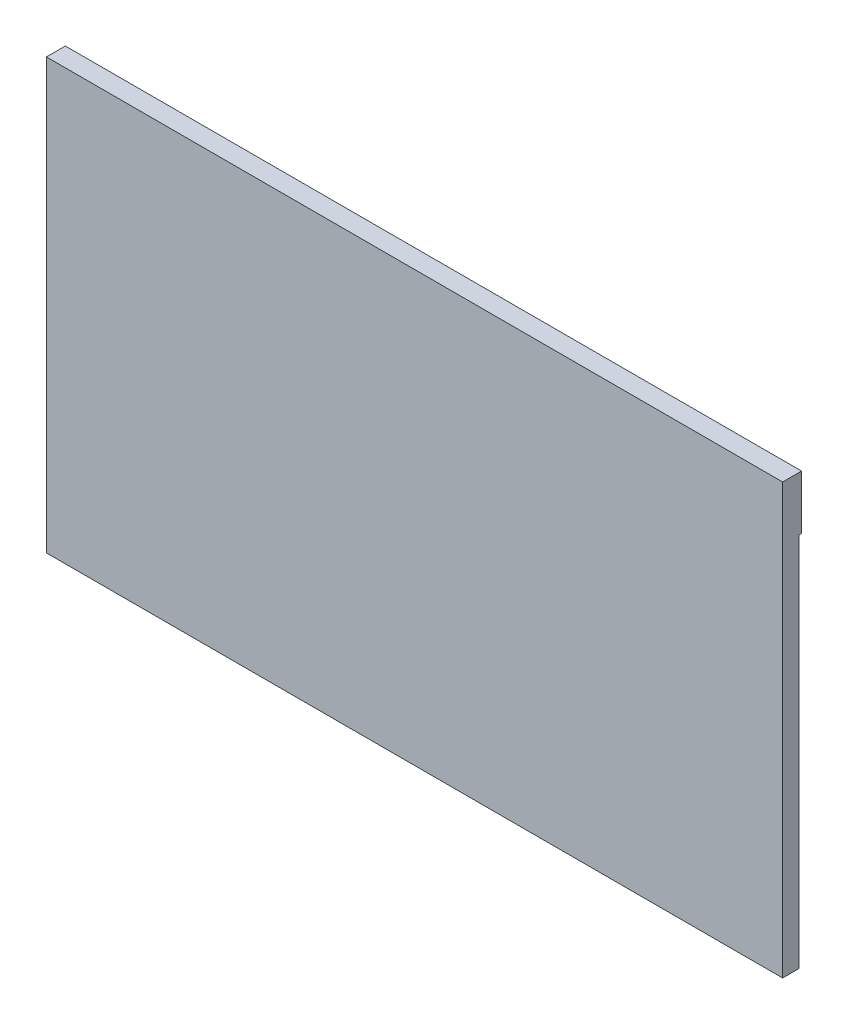
ISO-10303-21;
HEADER;
FILE_DESCRIPTION(('STEP AP214'),'2;1');
FILE_NAME('part.step','',(''),(''),'','','');
FILE_SCHEMA(('AUTOMOTIVE_DESIGN { 1 0 10303 214 1 1 1 1 }'));
ENDSEC;
DATA;
#1=APPLICATION_CONTEXT('core data for automotive mechanical design processes');
#2=APPLICATION_PROTOCOL_DEFINITION('international standard','automotive_design',2000,#1);
#3=PRODUCT_CONTEXT('',#1,'mechanical');
#4=PRODUCT('Part','Part','',(#3));
#5=PRODUCT_RELATED_PRODUCT_CATEGORY('part','',(#4));
#6=PRODUCT_DEFINITION_FORMATION('','',#4);
#7=PRODUCT_DEFINITION_CONTEXT('part definition',#1,'design');
#8=PRODUCT_DEFINITION('design','',#6,#7);
#9=PRODUCT_DEFINITION_SHAPE('','',#8);
#10=(LENGTH_UNIT() NAMED_UNIT(*) SI_UNIT(.MILLI.,.METRE.));
#11=(NAMED_UNIT(*) PLANE_ANGLE_UNIT() SI_UNIT($,.RADIAN.));
#12=(NAMED_UNIT(*) SI_UNIT($,.STERADIAN.) SOLID_ANGLE_UNIT());
#13=UNCERTAINTY_MEASURE_WITH_UNIT(LENGTH_MEASURE(1.E-05),#10,'distance_accuracy_value','');
#14=(GEOMETRIC_REPRESENTATION_CONTEXT(3) GLOBAL_UNCERTAINTY_ASSIGNED_CONTEXT((#13)) GLOBAL_UNIT_ASSIGNED_CONTEXT((#10,
#11,#12)) REPRESENTATION_CONTEXT('',''));
#15=CARTESIAN_POINT('',(0.,0.,0.));
#16=DIRECTION('',(0.,0.,1.));
#17=DIRECTION('',(1.,0.,0.));
#18=AXIS2_PLACEMENT_3D('',#15,#16,#17);
#19=CARTESIAN_POINT('',(0.,0.,0.));
#20=DIRECTION('',(0.,0.,1.));
#21=DIRECTION('',(1.,0.,0.));
#22=AXIS2_PLACEMENT_3D('',#19,#20,#21);
#23=PLANE('',#22);
#24=DIRECTION('',(0.,-1.,0.));
#25=VECTOR('',#24,1.);
#26=CARTESIAN_POINT('',(197.5,139.,0.));
#27=LINE('',#26,#25);
#28=CARTESIAN_POINT('',(197.5,119.,0.));
#29=VERTEX_POINT('',#28);
#30=CARTESIAN_POINT('',(197.5,109.,0.));
#31=VERTEX_POINT('',#30);
#32=EDGE_CURVE('E156',#29,#31,#27,.T.);
#33=ORIENTED_EDGE('',*,*,#32,.F.);
#34=DIRECTION('',(-1.,0.,0.));
#35=VECTOR('',#34,1.);
#36=CARTESIAN_POINT('',(272.5,119.,0.));
#37=LINE('',#36,#35);
#38=CARTESIAN_POINT('',(272.5,119.,0.));
#39=VERTEX_POINT('',#38);
#40=EDGE_CURVE('E63',#39,#29,#37,.T.);
#41=ORIENTED_EDGE('',*,*,#40,.F.);
#42=DIRECTION('',(0.,1.,0.));
#43=VECTOR('',#42,1.);
#44=CARTESIAN_POINT('',(272.5,159.,0.));
#45=LINE('',#44,#43);
#46=CARTESIAN_POINT('',(272.5,-159.,0.));
#47=VERTEX_POINT('',#46);
#48=EDGE_CURVE('E197',#47,#39,#45,.T.);
#49=ORIENTED_EDGE('',*,*,#48,.F.);
#50=DIRECTION('',(1.,0.,0.));
#51=VECTOR('',#50,1.);
#52=CARTESIAN_POINT('',(-272.5,-159.,0.));
#53=LINE('',#52,#51);
#54=CARTESIAN_POINT('',(-272.5,-159.,0.));
#55=VERTEX_POINT('',#54);
#56=EDGE_CURVE('E203',#55,#47,#53,.T.);
#57=ORIENTED_EDGE('',*,*,#56,.F.);
#58=DIRECTION('',(0.,-1.,0.));
#59=VECTOR('',#58,1.);
#60=CARTESIAN_POINT('',(-272.5,159.,0.));
#61=LINE('',#60,#59);
#62=CARTESIAN_POINT('',(-272.5,119.,0.));
#63=VERTEX_POINT('',#62);
#64=EDGE_CURVE('E215',#63,#55,#61,.T.);
#65=ORIENTED_EDGE('',*,*,#64,.F.);
#66=CARTESIAN_POINT('',(147.5,119.,0.));
#67=VERTEX_POINT('',#66);
#68=EDGE_CURVE('E169',#67,#63,#37,.T.);
#69=ORIENTED_EDGE('',*,*,#68,.F.);
#70=DIRECTION('',(0.,1.,0.));
#71=VECTOR('',#70,1.);
#72=CARTESIAN_POINT('',(147.5,139.,0.));
#73=LINE('',#72,#71);
#74=CARTESIAN_POINT('',(147.5,109.,0.));
#75=VERTEX_POINT('',#74);
#76=EDGE_CURVE('E153',#75,#67,#73,.T.);
#77=ORIENTED_EDGE('',*,*,#76,.F.);
#78=DIRECTION('',(-1.,0.,0.));
#79=VECTOR('',#78,1.);
#80=CARTESIAN_POINT('',(197.5,109.,0.));
#81=LINE('',#80,#79);
#82=EDGE_CURVE('E269',#31,#75,#81,.T.);
#83=ORIENTED_EDGE('',*,*,#82,.F.);
#84=EDGE_LOOP('',(#33,#41,#49,#57,#65,#69,#77,#83));
#85=FACE_BOUND('',#84,.T.);
#86=ADVANCED_FACE('F39',(#85),#23,.F.);
#87=CARTESIAN_POINT('',(272.5,119.,-2.));
#88=DIRECTION('',(0.,1.,0.));
#89=DIRECTION('',(0.,0.,1.));
#90=AXIS2_PLACEMENT_3D('',#87,#88,#89);
#91=PLANE('',#90);
#92=DIRECTION('',(0.,0.,1.));
#93=VECTOR('',#92,1.);
#94=CARTESIAN_POINT('',(197.5,119.,-2.));
#95=LINE('',#94,#93);
#96=CARTESIAN_POINT('',(197.5,119.,-2.));
#97=VERTEX_POINT('',#96);
#98=EDGE_CURVE('E162',#97,#29,#95,.T.);
#99=ORIENTED_EDGE('',*,*,#98,.F.);
#100=DIRECTION('',(-1.,0.,0.));
#101=VECTOR('',#100,1.);
#102=CARTESIAN_POINT('',(272.5,119.,-2.));
#103=LINE('',#102,#101);
#104=CARTESIAN_POINT('',(272.5,119.,-2.));
#105=VERTEX_POINT('',#104);
#106=EDGE_CURVE('E175',#105,#97,#103,.T.);
#107=ORIENTED_EDGE('',*,*,#106,.F.);
#108=DIRECTION('',(0.,0.,1.));
#109=VECTOR('',#108,1.);
#110=CARTESIAN_POINT('',(272.5,119.,-2.));
#111=LINE('',#110,#109);
#112=EDGE_CURVE('E193',#105,#39,#111,.T.);
#113=ORIENTED_EDGE('',*,*,#112,.T.);
#114=ORIENTED_EDGE('',*,*,#40,.T.);
#115=EDGE_LOOP('',(#99,#107,#113,#114));
#116=FACE_BOUND('',#115,.T.);
#117=ADVANCED_FACE('F268',(#116),#91,.F.);
#118=DIRECTION('',(0.,0.,-1.));
#119=VECTOR('',#118,1.);
#120=CARTESIAN_POINT('',(147.5,119.,-2.));
#121=LINE('',#120,#119);
#122=CARTESIAN_POINT('',(147.5,119.,-2.));
#123=VERTEX_POINT('',#122);
#124=EDGE_CURVE('E158',#67,#123,#121,.T.);
#125=ORIENTED_EDGE('',*,*,#124,.F.);
#126=ORIENTED_EDGE('',*,*,#68,.T.);
#127=DIRECTION('',(0.,0.,1.));
#128=VECTOR('',#127,1.);
#129=CARTESIAN_POINT('',(-272.5,119.,-2.));
#130=LINE('',#129,#128);
#131=CARTESIAN_POINT('',(-272.5,119.,-2.));
#132=VERTEX_POINT('',#131);
#133=EDGE_CURVE('E187',#132,#63,#130,.T.);
#134=ORIENTED_EDGE('',*,*,#133,.F.);
#135=EDGE_CURVE('E174',#123,#132,#103,.T.);
#136=ORIENTED_EDGE('',*,*,#135,.F.);
#137=EDGE_LOOP('',(#125,#126,#134,#136));
#138=FACE_BOUND('',#137,.T.);
#139=ADVANCED_FACE('F245',(#138),#91,.F.);
#140=CARTESIAN_POINT('',(0.,0.,-2.));
#141=DIRECTION('',(0.,0.,-1.));
#142=DIRECTION('',(-1.,0.,0.));
#143=AXIS2_PLACEMENT_3D('',#140,#141,#142);
#144=PLANE('',#143);
#145=ORIENTED_EDGE('',*,*,#106,.T.);
#146=DIRECTION('',(0.,1.,0.));
#147=VECTOR('',#146,1.);
#148=CARTESIAN_POINT('',(197.5,0.,-2.));
#149=LINE('',#148,#147);
#150=CARTESIAN_POINT('',(197.5,139.,-2.));
#151=VERTEX_POINT('',#150);
#152=EDGE_CURVE('E11',#97,#151,#149,.T.);
#153=ORIENTED_EDGE('',*,*,#152,.T.);
#154=DIRECTION('',(-1.,0.,0.));
#155=VECTOR('',#154,1.);
#156=CARTESIAN_POINT('',(0.,139.,-2.));
#157=LINE('',#156,#155);
#158=CARTESIAN_POINT('',(147.5,139.,-2.));
#159=VERTEX_POINT('',#158);
#160=EDGE_CURVE('E233',#151,#159,#157,.T.);
#161=ORIENTED_EDGE('',*,*,#160,.T.);
#162=DIRECTION('',(0.,-1.,0.));
#163=VECTOR('',#162,1.);
#164=CARTESIAN_POINT('',(147.5,0.,-2.));
#165=LINE('',#164,#163);
#166=EDGE_CURVE('E48',#159,#123,#165,.T.);
#167=ORIENTED_EDGE('',*,*,#166,.T.);
#168=ORIENTED_EDGE('',*,*,#135,.T.);
#169=DIRECTION('',(0.,1.,0.));
#170=VECTOR('',#169,1.);
#171=CARTESIAN_POINT('',(-272.5,159.,-2.));
#172=LINE('',#171,#170);
#173=CARTESIAN_POINT('',(-272.5,159.,-2.));
#174=VERTEX_POINT('',#173);
#175=EDGE_CURVE('E179',#132,#174,#172,.T.);
#176=ORIENTED_EDGE('',*,*,#175,.T.);
#177=DIRECTION('',(1.,0.,0.));
#178=VECTOR('',#177,1.);
#179=CARTESIAN_POINT('',(272.5,159.,-2.));
#180=LINE('',#179,#178);
#181=CARTESIAN_POINT('',(272.5,159.,-2.));
#182=VERTEX_POINT('',#181);
#183=EDGE_CURVE('E183',#174,#182,#180,.T.);
#184=ORIENTED_EDGE('',*,*,#183,.T.);
#185=DIRECTION('',(0.,-1.,0.));
#186=VECTOR('',#185,1.);
#187=CARTESIAN_POINT('',(272.5,159.,-2.));
#188=LINE('',#187,#186);
#189=EDGE_CURVE('E170',#182,#105,#188,.T.);
#190=ORIENTED_EDGE('',*,*,#189,.T.);
#191=EDGE_LOOP('',(#145,#153,#161,#167,#168,#176,#184,#190));
#192=FACE_BOUND('',#191,.T.);
#193=ADVANCED_FACE('F240',(#192),#144,.T.);
#194=CARTESIAN_POINT('',(272.5,159.,12.));
#195=DIRECTION('',(-1.,0.,0.));
#196=DIRECTION('',(0.,-1.,0.));
#197=AXIS2_PLACEMENT_3D('',#194,#195,#196);
#198=PLANE('',#197);
#199=ORIENTED_EDGE('',*,*,#48,.T.);
#200=ORIENTED_EDGE('',*,*,#112,.F.);
#201=ORIENTED_EDGE('',*,*,#189,.F.);
#202=DIRECTION('',(0.,0.,-1.));
#203=VECTOR('',#202,1.);
#204=CARTESIAN_POINT('',(272.5,159.,12.));
#205=LINE('',#204,#203);
#206=CARTESIAN_POINT('',(272.5,159.,12.));
#207=VERTEX_POINT('',#206);
#208=EDGE_CURVE('E230',#207,#182,#205,.T.);
#209=ORIENTED_EDGE('',*,*,#208,.F.);
#210=DIRECTION('',(0.,1.,0.));
#211=VECTOR('',#210,1.);
#212=CARTESIAN_POINT('',(272.5,159.,12.));
#213=LINE('',#212,#211);
#214=CARTESIAN_POINT('',(272.5,-159.,12.));
#215=VERTEX_POINT('',#214);
#216=EDGE_CURVE('E198',#215,#207,#213,.T.);
#217=ORIENTED_EDGE('',*,*,#216,.F.);
#218=DIRECTION('',(0.,0.,-1.));
#219=VECTOR('',#218,1.);
#220=CARTESIAN_POINT('',(272.5,-159.,12.));
#221=LINE('',#220,#219);
#222=EDGE_CURVE('E212',#215,#47,#221,.T.);
#223=ORIENTED_EDGE('',*,*,#222,.T.);
#224=EDGE_LOOP('',(#199,#200,#201,#209,#217,#223));
#225=FACE_BOUND('',#224,.T.);
#226=ADVANCED_FACE('F41',(#225),#198,.F.);
#227=CARTESIAN_POINT('',(-272.5,159.,12.));
#228=DIRECTION('',(0.,-1.,0.));
#229=DIRECTION('',(0.,0.,-1.));
#230=AXIS2_PLACEMENT_3D('',#227,#228,#229);
#231=PLANE('',#230);
#232=ORIENTED_EDGE('',*,*,#208,.T.);
#233=ORIENTED_EDGE('',*,*,#183,.F.);
#234=DIRECTION('',(0.,0.,-1.));
#235=VECTOR('',#234,1.);
#236=CARTESIAN_POINT('',(-272.5,159.,12.));
#237=LINE('',#236,#235);
#238=CARTESIAN_POINT('',(-272.5,159.,12.));
#239=VERTEX_POINT('',#238);
#240=EDGE_CURVE('E227',#239,#174,#237,.T.);
#241=ORIENTED_EDGE('',*,*,#240,.F.);
#242=DIRECTION('',(-1.,0.,0.));
#243=VECTOR('',#242,1.);
#244=CARTESIAN_POINT('',(-272.5,159.,12.));
#245=LINE('',#244,#243);
#246=EDGE_CURVE('E202',#207,#239,#245,.T.);
#247=ORIENTED_EDGE('',*,*,#246,.F.);
#248=EDGE_LOOP('',(#232,#233,#241,#247));
#249=FACE_BOUND('',#248,.T.);
#250=ADVANCED_FACE('F261',(#249),#231,.F.);
#251=CARTESIAN_POINT('',(-272.5,159.,12.));
#252=DIRECTION('',(1.,0.,0.));
#253=DIRECTION('',(0.,1.,0.));
#254=AXIS2_PLACEMENT_3D('',#251,#252,#253);
#255=PLANE('',#254);
#256=ORIENTED_EDGE('',*,*,#240,.T.);
#257=ORIENTED_EDGE('',*,*,#175,.F.);
#258=ORIENTED_EDGE('',*,*,#133,.T.);
#259=ORIENTED_EDGE('',*,*,#64,.T.);
#260=DIRECTION('',(0.,0.,-1.));
#261=VECTOR('',#260,1.);
#262=CARTESIAN_POINT('',(-272.5,-159.,12.));
#263=LINE('',#262,#261);
#264=CARTESIAN_POINT('',(-272.5,-159.,12.));
#265=VERTEX_POINT('',#264);
#266=EDGE_CURVE('E223',#265,#55,#263,.T.);
#267=ORIENTED_EDGE('',*,*,#266,.F.);
#268=DIRECTION('',(0.,-1.,0.));
#269=VECTOR('',#268,1.);
#270=CARTESIAN_POINT('',(-272.5,159.,12.));
#271=LINE('',#270,#269);
#272=EDGE_CURVE('E206',#239,#265,#271,.T.);
#273=ORIENTED_EDGE('',*,*,#272,.F.);
#274=EDGE_LOOP('',(#256,#257,#258,#259,#267,#273));
#275=FACE_BOUND('',#274,.T.);
#276=ADVANCED_FACE('F255',(#275),#255,.F.);
#277=CARTESIAN_POINT('',(-272.5,-159.,12.));
#278=DIRECTION('',(0.,1.,0.));
#279=DIRECTION('',(0.,0.,1.));
#280=AXIS2_PLACEMENT_3D('',#277,#278,#279);
#281=PLANE('',#280);
#282=ORIENTED_EDGE('',*,*,#56,.T.);
#283=ORIENTED_EDGE('',*,*,#222,.F.);
#284=DIRECTION('',(1.,0.,0.));
#285=VECTOR('',#284,1.);
#286=CARTESIAN_POINT('',(-272.5,-159.,12.));
#287=LINE('',#286,#285);
#288=EDGE_CURVE('E209',#265,#215,#287,.T.);
#289=ORIENTED_EDGE('',*,*,#288,.F.);
#290=ORIENTED_EDGE('',*,*,#266,.T.);
#291=EDGE_LOOP('',(#282,#283,#289,#290));
#292=FACE_BOUND('',#291,.T.);
#293=ADVANCED_FACE('F304',(#292),#281,.F.);
#294=CARTESIAN_POINT('',(0.,0.,12.));
#295=DIRECTION('',(0.,0.,1.));
#296=DIRECTION('',(1.,0.,0.));
#297=AXIS2_PLACEMENT_3D('',#294,#295,#296);
#298=PLANE('',#297);
#299=ORIENTED_EDGE('',*,*,#216,.T.);
#300=ORIENTED_EDGE('',*,*,#246,.T.);
#301=ORIENTED_EDGE('',*,*,#272,.T.);
#302=ORIENTED_EDGE('',*,*,#288,.T.);
#303=EDGE_LOOP('',(#299,#300,#301,#302));
#304=FACE_BOUND('',#303,.T.);
#305=ADVANCED_FACE('F303',(#304),#298,.T.);
#306=CARTESIAN_POINT('',(197.5,139.,-4.));
#307=DIRECTION('',(-1.,0.,0.));
#308=DIRECTION('',(0.,0.,1.));
#309=AXIS2_PLACEMENT_3D('',#306,#307,#308);
#310=PLANE('',#309);
#311=ORIENTED_EDGE('',*,*,#152,.F.);
#312=ORIENTED_EDGE('',*,*,#98,.T.);
#313=ORIENTED_EDGE('',*,*,#32,.T.);
#314=DIRECTION('',(0.,0.,1.));
#315=VECTOR('',#314,1.);
#316=CARTESIAN_POINT('',(197.5,109.,-4.));
#317=LINE('',#316,#315);
#318=CARTESIAN_POINT('',(197.5,109.,-4.));
#319=VERTEX_POINT('',#318);
#320=EDGE_CURVE('E136',#319,#31,#317,.T.);
#321=ORIENTED_EDGE('',*,*,#320,.F.);
#322=DIRECTION('',(0.,-1.,0.));
#323=VECTOR('',#322,1.);
#324=CARTESIAN_POINT('',(197.5,139.,-4.));
#325=LINE('',#324,#323);
#326=CARTESIAN_POINT('',(197.5,139.,-4.));
#327=VERTEX_POINT('',#326);
#328=EDGE_CURVE('E144',#327,#319,#325,.T.);
#329=ORIENTED_EDGE('',*,*,#328,.F.);
#330=DIRECTION('',(0.,0.,1.));
#331=VECTOR('',#330,1.);
#332=CARTESIAN_POINT('',(197.5,139.,-4.));
#333=LINE('',#332,#331);
#334=EDGE_CURVE('E279',#327,#151,#333,.T.);
#335=ORIENTED_EDGE('',*,*,#334,.T.);
#336=EDGE_LOOP('',(#311,#312,#313,#321,#329,#335));
#337=FACE_BOUND('',#336,.T.);
#338=ADVANCED_FACE('F155',(#337),#310,.F.);
#339=CARTESIAN_POINT('',(147.5,139.,-4.));
#340=DIRECTION('',(1.,0.,0.));
#341=DIRECTION('',(0.,0.,-1.));
#342=AXIS2_PLACEMENT_3D('',#339,#340,#341);
#343=PLANE('',#342);
#344=ORIENTED_EDGE('',*,*,#76,.T.);
#345=ORIENTED_EDGE('',*,*,#124,.T.);
#346=ORIENTED_EDGE('',*,*,#166,.F.);
#347=DIRECTION('',(0.,0.,1.));
#348=VECTOR('',#347,1.);
#349=CARTESIAN_POINT('',(147.5,139.,-4.));
#350=LINE('',#349,#348);
#351=CARTESIAN_POINT('',(147.5,139.,-4.));
#352=VERTEX_POINT('',#351);
#353=EDGE_CURVE('E55',#352,#159,#350,.T.);
#354=ORIENTED_EDGE('',*,*,#353,.F.);
#355=DIRECTION('',(0.,1.,0.));
#356=VECTOR('',#355,1.);
#357=CARTESIAN_POINT('',(147.5,139.,-4.));
#358=LINE('',#357,#356);
#359=CARTESIAN_POINT('',(147.5,109.,-4.));
#360=VERTEX_POINT('',#359);
#361=EDGE_CURVE('E143',#360,#352,#358,.T.);
#362=ORIENTED_EDGE('',*,*,#361,.F.);
#363=DIRECTION('',(0.,0.,1.));
#364=VECTOR('',#363,1.);
#365=CARTESIAN_POINT('',(147.5,109.,-4.));
#366=LINE('',#365,#364);
#367=EDGE_CURVE('E139',#360,#75,#366,.T.);
#368=ORIENTED_EDGE('',*,*,#367,.T.);
#369=EDGE_LOOP('',(#344,#345,#346,#354,#362,#368));
#370=FACE_BOUND('',#369,.T.);
#371=ADVANCED_FACE('F284',(#370),#343,.F.);
#372=CARTESIAN_POINT('',(197.5,109.,-4.));
#373=DIRECTION('',(0.,1.,0.));
#374=DIRECTION('',(-1.,0.,0.));
#375=AXIS2_PLACEMENT_3D('',#372,#373,#374);
#376=PLANE('',#375);
#377=ORIENTED_EDGE('',*,*,#82,.T.);
#378=ORIENTED_EDGE('',*,*,#367,.F.);
#379=DIRECTION('',(-1.,0.,0.));
#380=VECTOR('',#379,1.);
#381=CARTESIAN_POINT('',(197.5,109.,-4.));
#382=LINE('',#381,#380);
#383=EDGE_CURVE('E132',#319,#360,#382,.T.);
#384=ORIENTED_EDGE('',*,*,#383,.F.);
#385=ORIENTED_EDGE('',*,*,#320,.T.);
#386=EDGE_LOOP('',(#377,#378,#384,#385));
#387=FACE_BOUND('',#386,.T.);
#388=ADVANCED_FACE('F134',(#387),#376,.F.);
#389=CARTESIAN_POINT('',(197.5,139.,-4.));
#390=DIRECTION('',(0.,-1.,0.));
#391=DIRECTION('',(1.,0.,0.));
#392=AXIS2_PLACEMENT_3D('',#389,#390,#391);
#393=PLANE('',#392);
#394=ORIENTED_EDGE('',*,*,#160,.F.);
#395=ORIENTED_EDGE('',*,*,#334,.F.);
#396=DIRECTION('',(1.,0.,0.));
#397=VECTOR('',#396,1.);
#398=CARTESIAN_POINT('',(197.5,139.,-4.));
#399=LINE('',#398,#397);
#400=EDGE_CURVE('E148',#352,#327,#399,.T.);
#401=ORIENTED_EDGE('',*,*,#400,.F.);
#402=ORIENTED_EDGE('',*,*,#353,.T.);
#403=EDGE_LOOP('',(#394,#395,#401,#402));
#404=FACE_BOUND('',#403,.T.);
#405=ADVANCED_FACE('F285',(#404),#393,.F.);
#406=CARTESIAN_POINT('',(0.,0.,-4.));
#407=DIRECTION('',(0.,0.,-1.));
#408=DIRECTION('',(-1.,0.,0.));
#409=AXIS2_PLACEMENT_3D('',#406,#407,#408);
#410=PLANE('',#409);
#411=ORIENTED_EDGE('',*,*,#328,.T.);
#412=ORIENTED_EDGE('',*,*,#383,.T.);
#413=ORIENTED_EDGE('',*,*,#361,.T.);
#414=ORIENTED_EDGE('',*,*,#400,.T.);
#415=EDGE_LOOP('',(#411,#412,#413,#414));
#416=FACE_BOUND('',#415,.T.);
#417=ADVANCED_FACE('F147',(#416),#410,.T.);
#418=CLOSED_SHELL('',(#86,#117,#139,#193,#226,#250,#276,#293,#305,#338,#371,#388,#405,#417));
#419=MANIFOLD_SOLID_BREP('B2',#418);
#420=ADVANCED_BREP_SHAPE_REPRESENTATION('',(#18,#419),#14);
#421=SHAPE_DEFINITION_REPRESENTATION(#9,#420);
ENDSEC;
END-ISO-10303-21;
